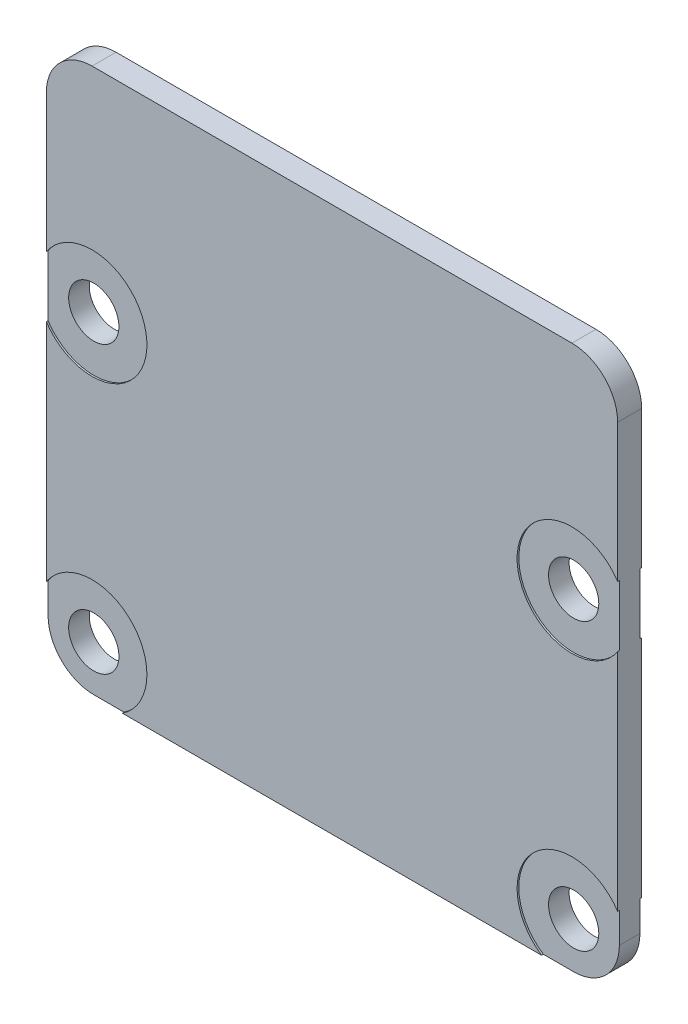
ISO-10303-21;
HEADER;
FILE_DESCRIPTION(('STEP AP214'),'2;1');
FILE_NAME('part.step','',(''),(''),'','','');
FILE_SCHEMA(('AUTOMOTIVE_DESIGN { 1 0 10303 214 1 1 1 1 }'));
ENDSEC;
DATA;
#1=APPLICATION_CONTEXT('core data for automotive mechanical design processes');
#2=APPLICATION_PROTOCOL_DEFINITION('international standard','automotive_design',2000,#1);
#3=PRODUCT_CONTEXT('',#1,'mechanical');
#4=PRODUCT('Part','Part','',(#3));
#5=PRODUCT_RELATED_PRODUCT_CATEGORY('part','',(#4));
#6=PRODUCT_DEFINITION_FORMATION('','',#4);
#7=PRODUCT_DEFINITION_CONTEXT('part definition',#1,'design');
#8=PRODUCT_DEFINITION('design','',#6,#7);
#9=PRODUCT_DEFINITION_SHAPE('','',#8);
#10=(LENGTH_UNIT() NAMED_UNIT(*) SI_UNIT(.MILLI.,.METRE.));
#11=(NAMED_UNIT(*) PLANE_ANGLE_UNIT() SI_UNIT($,.RADIAN.));
#12=(NAMED_UNIT(*) SI_UNIT($,.STERADIAN.) SOLID_ANGLE_UNIT());
#13=UNCERTAINTY_MEASURE_WITH_UNIT(LENGTH_MEASURE(1.E-05),#10,'distance_accuracy_value','');
#14=(GEOMETRIC_REPRESENTATION_CONTEXT(3) GLOBAL_UNCERTAINTY_ASSIGNED_CONTEXT((#13)) GLOBAL_UNIT_ASSIGNED_CONTEXT((#10,
#11,#12)) REPRESENTATION_CONTEXT('',''));
#15=CARTESIAN_POINT('',(0.,0.,0.));
#16=DIRECTION('',(0.,0.,1.));
#17=DIRECTION('',(1.,0.,0.));
#18=AXIS2_PLACEMENT_3D('',#15,#16,#17);
#19=CARTESIAN_POINT('',(0.,0.,-0.9));
#20=DIRECTION('',(0.,0.,1.));
#21=DIRECTION('',(1.,0.,0.));
#22=AXIS2_PLACEMENT_3D('',#19,#20,#21);
#23=PLANE('',#22);
#24=CARTESIAN_POINT('',(-10.5,0.100000000000003,-0.9));
#25=DIRECTION('',(0.,0.,1.));
#26=DIRECTION('',(1.,0.,0.));
#27=AXIS2_PLACEMENT_3D('',#24,#25,#26);
#28=CIRCLE('',#27,1.1);
#29=CARTESIAN_POINT('',(-9.4,0.100000000000003,-0.9));
#30=VERTEX_POINT('',#29);
#31=EDGE_CURVE('E348',#30,#30,#28,.T.);
#32=ORIENTED_EDGE('',*,*,#31,.T.);
#33=EDGE_LOOP('',(#32));
#34=FACE_BOUND('',#33,.T.);
#35=CARTESIAN_POINT('',(-10.5,0.100000000000003,-0.9));
#36=DIRECTION('',(0.,0.,1.));
#37=DIRECTION('',(-1.,0.,0.));
#38=AXIS2_PLACEMENT_3D('',#35,#36,#37);
#39=CIRCLE('',#38,2.4);
#40=CARTESIAN_POINT('',(-12.5,-1.22664991614215,-0.9));
#41=VERTEX_POINT('',#40);
#42=CARTESIAN_POINT('',(-12.5,1.42664991614216,-0.9));
#43=VERTEX_POINT('',#42);
#44=EDGE_CURVE('E216',#41,#43,#39,.T.);
#45=ORIENTED_EDGE('',*,*,#44,.F.);
#46=DIRECTION('',(0.,-1.,0.));
#47=VECTOR('',#46,1.);
#48=CARTESIAN_POINT('',(-12.5,9.462,-0.9));
#49=LINE('',#48,#47);
#50=EDGE_CURVE('E356',#43,#41,#49,.T.);
#51=ORIENTED_EDGE('',*,*,#50,.F.);
#52=EDGE_LOOP('',(#45,#51));
#53=FACE_BOUND('',#52,.T.);
#54=ADVANCED_FACE('F34',(#34,#53),#23,.F.);
#55=CARTESIAN_POINT('',(-10.5,-12.4,-0.9));
#56=DIRECTION('',(0.,0.,1.));
#57=DIRECTION('',(1.,0.,0.));
#58=AXIS2_PLACEMENT_3D('',#55,#56,#57);
#59=CIRCLE('',#58,1.1);
#60=CARTESIAN_POINT('',(-9.4,-12.4,-0.9));
#61=VERTEX_POINT('',#60);
#62=EDGE_CURVE('E330',#61,#61,#59,.T.);
#63=ORIENTED_EDGE('',*,*,#62,.T.);
#64=EDGE_LOOP('',(#63));
#65=FACE_BOUND('',#64,.T.);
#66=CARTESIAN_POINT('',(-10.5,-12.4,-0.9));
#67=DIRECTION('',(0.,0.,1.));
#68=DIRECTION('',(-1.,0.,0.));
#69=AXIS2_PLACEMENT_3D('',#66,#67,#68);
#70=CIRCLE('',#69,2.4);
#71=CARTESIAN_POINT('',(-9.17335008385784,-14.4,-0.9));
#72=VERTEX_POINT('',#71);
#73=CARTESIAN_POINT('',(-12.5,-11.0733500838578,-0.9));
#74=VERTEX_POINT('',#73);
#75=EDGE_CURVE('E219',#72,#74,#70,.T.);
#76=ORIENTED_EDGE('',*,*,#75,.F.);
#77=DIRECTION('',(1.,0.,0.));
#78=VECTOR('',#77,1.);
#79=CARTESIAN_POINT('',(-12.5,-14.4,-0.9));
#80=LINE('',#79,#78);
#81=CARTESIAN_POINT('',(-10.5,-14.4,-0.9));
#82=VERTEX_POINT('',#81);
#83=EDGE_CURVE('E358',#82,#72,#80,.T.);
#84=ORIENTED_EDGE('',*,*,#83,.F.);
#85=CARTESIAN_POINT('',(-10.5,-12.4,-0.9));
#86=DIRECTION('',(0.,0.,1.));
#87=DIRECTION('',(1.,0.,0.));
#88=AXIS2_PLACEMENT_3D('',#85,#86,#87);
#89=CIRCLE('',#88,2.);
#90=CARTESIAN_POINT('',(-12.5,-12.4,-0.9));
#91=VERTEX_POINT('',#90);
#92=EDGE_CURVE('E389',#82,#91,#89,.F.);
#93=ORIENTED_EDGE('',*,*,#92,.T.);
#94=EDGE_CURVE('E354',#74,#91,#49,.T.);
#95=ORIENTED_EDGE('',*,*,#94,.F.);
#96=EDGE_LOOP('',(#76,#84,#93,#95));
#97=FACE_BOUND('',#96,.T.);
#98=ADVANCED_FACE('F430',(#65,#97),#23,.F.);
#99=CARTESIAN_POINT('',(10.5,-12.4,-0.9));
#100=DIRECTION('',(0.,0.,1.));
#101=DIRECTION('',(1.,0.,0.));
#102=AXIS2_PLACEMENT_3D('',#99,#100,#101);
#103=CIRCLE('',#102,1.1);
#104=CARTESIAN_POINT('',(11.6,-12.4,-0.9));
#105=VERTEX_POINT('',#104);
#106=EDGE_CURVE('E337',#105,#105,#103,.T.);
#107=ORIENTED_EDGE('',*,*,#106,.T.);
#108=EDGE_LOOP('',(#107));
#109=FACE_BOUND('',#108,.T.);
#110=CARTESIAN_POINT('',(10.5,-12.4,-0.9));
#111=DIRECTION('',(0.,0.,1.));
#112=DIRECTION('',(-1.,0.,0.));
#113=AXIS2_PLACEMENT_3D('',#110,#111,#112);
#114=CIRCLE('',#113,2.4);
#115=CARTESIAN_POINT('',(12.5,-11.0733500838578,-0.9));
#116=VERTEX_POINT('',#115);
#117=CARTESIAN_POINT('',(9.17335008385784,-14.4,-0.9));
#118=VERTEX_POINT('',#117);
#119=EDGE_CURVE('E56',#116,#118,#114,.T.);
#120=ORIENTED_EDGE('',*,*,#119,.F.);
#121=DIRECTION('',(0.,1.,0.));
#122=VECTOR('',#121,1.);
#123=CARTESIAN_POINT('',(12.5,9.462,-0.9));
#124=LINE('',#123,#122);
#125=CARTESIAN_POINT('',(12.5,-12.4,-0.9));
#126=VERTEX_POINT('',#125);
#127=EDGE_CURVE('E363',#126,#116,#124,.T.);
#128=ORIENTED_EDGE('',*,*,#127,.F.);
#129=CARTESIAN_POINT('',(10.5,-12.4,-0.9));
#130=DIRECTION('',(0.,0.,1.));
#131=DIRECTION('',(1.,0.,0.));
#132=AXIS2_PLACEMENT_3D('',#129,#130,#131);
#133=CIRCLE('',#132,2.);
#134=CARTESIAN_POINT('',(10.5,-14.4,-0.9));
#135=VERTEX_POINT('',#134);
#136=EDGE_CURVE('E386',#126,#135,#133,.F.);
#137=ORIENTED_EDGE('',*,*,#136,.T.);
#138=EDGE_CURVE('E362',#118,#135,#80,.T.);
#139=ORIENTED_EDGE('',*,*,#138,.F.);
#140=EDGE_LOOP('',(#120,#128,#137,#139));
#141=FACE_BOUND('',#140,.T.);
#142=ADVANCED_FACE('F403',(#109,#141),#23,.F.);
#143=CARTESIAN_POINT('',(10.5,0.100000000000003,-0.9));
#144=DIRECTION('',(0.,0.,1.));
#145=DIRECTION('',(1.,0.,0.));
#146=AXIS2_PLACEMENT_3D('',#143,#144,#145);
#147=CIRCLE('',#146,1.1);
#148=CARTESIAN_POINT('',(11.6,0.100000000000003,-0.9));
#149=VERTEX_POINT('',#148);
#150=EDGE_CURVE('E343',#149,#149,#147,.T.);
#151=ORIENTED_EDGE('',*,*,#150,.T.);
#152=EDGE_LOOP('',(#151));
#153=FACE_BOUND('',#152,.T.);
#154=CARTESIAN_POINT('',(10.5,0.100000000000003,-0.9));
#155=DIRECTION('',(0.,0.,1.));
#156=DIRECTION('',(-1.,0.,0.));
#157=AXIS2_PLACEMENT_3D('',#154,#155,#156);
#158=CIRCLE('',#157,2.4);
#159=CARTESIAN_POINT('',(12.5,1.42664991614216,-0.9));
#160=VERTEX_POINT('',#159);
#161=CARTESIAN_POINT('',(12.5,-1.22664991614215,-0.9));
#162=VERTEX_POINT('',#161);
#163=EDGE_CURVE('E48',#160,#162,#158,.T.);
#164=ORIENTED_EDGE('',*,*,#163,.F.);
#165=EDGE_CURVE('E361',#162,#160,#124,.T.);
#166=ORIENTED_EDGE('',*,*,#165,.F.);
#167=EDGE_LOOP('',(#164,#166));
#168=FACE_BOUND('',#167,.T.);
#169=ADVANCED_FACE('F493',(#153,#168),#23,.F.);
#170=CARTESIAN_POINT('',(0.,0.,0.));
#171=DIRECTION('',(0.,0.,1.));
#172=DIRECTION('',(1.,0.,0.));
#173=AXIS2_PLACEMENT_3D('',#170,#171,#172);
#174=PLANE('',#173);
#175=CARTESIAN_POINT('',(10.5,0.100000000000003,0.));
#176=DIRECTION('',(0.,0.,1.));
#177=DIRECTION('',(1.,0.,0.));
#178=AXIS2_PLACEMENT_3D('',#175,#176,#177);
#179=CIRCLE('',#178,1.1);
#180=CARTESIAN_POINT('',(11.6,0.100000000000003,0.));
#181=VERTEX_POINT('',#180);
#182=EDGE_CURVE('E329',#181,#181,#179,.T.);
#183=ORIENTED_EDGE('',*,*,#182,.F.);
#184=EDGE_LOOP('',(#183));
#185=FACE_BOUND('',#184,.T.);
#186=CARTESIAN_POINT('',(10.5,0.100000000000003,0.));
#187=DIRECTION('',(0.,0.,-1.));
#188=DIRECTION('',(1.,0.,0.));
#189=AXIS2_PLACEMENT_3D('',#186,#187,#188);
#190=CIRCLE('',#189,2.4);
#191=CARTESIAN_POINT('',(12.5,-1.22664991614216,0.));
#192=VERTEX_POINT('',#191);
#193=CARTESIAN_POINT('',(12.5,1.42664991614216,0.));
#194=VERTEX_POINT('',#193);
#195=EDGE_CURVE('E271',#192,#194,#190,.T.);
#196=ORIENTED_EDGE('',*,*,#195,.F.);
#197=DIRECTION('',(0.,1.,0.));
#198=VECTOR('',#197,1.);
#199=CARTESIAN_POINT('',(12.5,9.462,0.));
#200=LINE('',#199,#198);
#201=EDGE_CURVE('E370',#192,#194,#200,.T.);
#202=ORIENTED_EDGE('',*,*,#201,.T.);
#203=EDGE_LOOP('',(#196,#202));
#204=FACE_BOUND('',#203,.T.);
#205=ADVANCED_FACE('F501',(#185,#204),#174,.T.);
#206=CARTESIAN_POINT('',(10.5,-12.4,0.));
#207=DIRECTION('',(0.,0.,1.));
#208=DIRECTION('',(1.,0.,0.));
#209=AXIS2_PLACEMENT_3D('',#206,#207,#208);
#210=CIRCLE('',#209,1.1);
#211=CARTESIAN_POINT('',(11.6,-12.4,0.));
#212=VERTEX_POINT('',#211);
#213=EDGE_CURVE('E340',#212,#212,#210,.T.);
#214=ORIENTED_EDGE('',*,*,#213,.F.);
#215=EDGE_LOOP('',(#214));
#216=FACE_BOUND('',#215,.T.);
#217=CARTESIAN_POINT('',(10.5,-12.4,0.));
#218=DIRECTION('',(0.,0.,-1.));
#219=DIRECTION('',(1.,0.,0.));
#220=AXIS2_PLACEMENT_3D('',#217,#218,#219);
#221=CIRCLE('',#220,2.4);
#222=CARTESIAN_POINT('',(9.17335008385784,-14.4,0.));
#223=VERTEX_POINT('',#222);
#224=CARTESIAN_POINT('',(12.5,-11.0733500838578,0.));
#225=VERTEX_POINT('',#224);
#226=EDGE_CURVE('E301',#223,#225,#221,.T.);
#227=ORIENTED_EDGE('',*,*,#226,.F.);
#228=DIRECTION('',(1.,0.,0.));
#229=VECTOR('',#228,1.);
#230=CARTESIAN_POINT('',(-12.5,-14.4,0.));
#231=LINE('',#230,#229);
#232=CARTESIAN_POINT('',(10.5,-14.4,0.));
#233=VERTEX_POINT('',#232);
#234=EDGE_CURVE('E371',#223,#233,#231,.T.);
#235=ORIENTED_EDGE('',*,*,#234,.T.);
#236=CARTESIAN_POINT('',(10.5,-12.4,0.));
#237=DIRECTION('',(0.,0.,1.));
#238=DIRECTION('',(1.,0.,0.));
#239=AXIS2_PLACEMENT_3D('',#236,#237,#238);
#240=CIRCLE('',#239,2.);
#241=CARTESIAN_POINT('',(12.5,-12.4,0.));
#242=VERTEX_POINT('',#241);
#243=EDGE_CURVE('E377',#233,#242,#240,.T.);
#244=ORIENTED_EDGE('',*,*,#243,.T.);
#245=EDGE_CURVE('E357',#242,#225,#200,.T.);
#246=ORIENTED_EDGE('',*,*,#245,.T.);
#247=EDGE_LOOP('',(#227,#235,#244,#246));
#248=FACE_BOUND('',#247,.T.);
#249=ADVANCED_FACE('F457',(#216,#248),#174,.T.);
#250=CARTESIAN_POINT('',(-10.5,-12.4,0.));
#251=DIRECTION('',(0.,0.,1.));
#252=DIRECTION('',(1.,0.,0.));
#253=AXIS2_PLACEMENT_3D('',#250,#251,#252);
#254=CIRCLE('',#253,1.1);
#255=CARTESIAN_POINT('',(-9.4,-12.4,0.));
#256=VERTEX_POINT('',#255);
#257=EDGE_CURVE('E334',#256,#256,#254,.T.);
#258=ORIENTED_EDGE('',*,*,#257,.F.);
#259=EDGE_LOOP('',(#258));
#260=FACE_BOUND('',#259,.T.);
#261=CARTESIAN_POINT('',(-10.5,-12.4,0.));
#262=DIRECTION('',(0.,0.,-1.));
#263=DIRECTION('',(1.,0.,0.));
#264=AXIS2_PLACEMENT_3D('',#261,#262,#263);
#265=CIRCLE('',#264,2.4);
#266=CARTESIAN_POINT('',(-12.5,-11.0733500838578,0.));
#267=VERTEX_POINT('',#266);
#268=CARTESIAN_POINT('',(-9.17335008385784,-14.4,0.));
#269=VERTEX_POINT('',#268);
#270=EDGE_CURVE('E298',#267,#269,#265,.T.);
#271=ORIENTED_EDGE('',*,*,#270,.F.);
#272=DIRECTION('',(0.,-1.,0.));
#273=VECTOR('',#272,1.);
#274=CARTESIAN_POINT('',(-12.5,9.462,0.));
#275=LINE('',#274,#273);
#276=CARTESIAN_POINT('',(-12.5,-12.4,0.));
#277=VERTEX_POINT('',#276);
#278=EDGE_CURVE('E351',#267,#277,#275,.T.);
#279=ORIENTED_EDGE('',*,*,#278,.T.);
#280=CARTESIAN_POINT('',(-10.5,-12.4,0.));
#281=DIRECTION('',(0.,0.,1.));
#282=DIRECTION('',(1.,0.,0.));
#283=AXIS2_PLACEMENT_3D('',#280,#281,#282);
#284=CIRCLE('',#283,2.);
#285=CARTESIAN_POINT('',(-10.5,-14.4,0.));
#286=VERTEX_POINT('',#285);
#287=EDGE_CURVE('E379',#277,#286,#284,.T.);
#288=ORIENTED_EDGE('',*,*,#287,.T.);
#289=EDGE_CURVE('E368',#286,#269,#231,.T.);
#290=ORIENTED_EDGE('',*,*,#289,.T.);
#291=EDGE_LOOP('',(#271,#279,#288,#290));
#292=FACE_BOUND('',#291,.T.);
#293=ADVANCED_FACE('F540',(#260,#292),#174,.T.);
#294=CARTESIAN_POINT('',(-10.5,0.100000000000003,0.));
#295=DIRECTION('',(0.,0.,1.));
#296=DIRECTION('',(1.,0.,0.));
#297=AXIS2_PLACEMENT_3D('',#294,#295,#296);
#298=CIRCLE('',#297,1.1);
#299=CARTESIAN_POINT('',(-9.4,0.100000000000003,0.));
#300=VERTEX_POINT('',#299);
#301=EDGE_CURVE('E333',#300,#300,#298,.T.);
#302=ORIENTED_EDGE('',*,*,#301,.F.);
#303=EDGE_LOOP('',(#302));
#304=FACE_BOUND('',#303,.T.);
#305=CARTESIAN_POINT('',(-10.5,0.100000000000003,0.));
#306=DIRECTION('',(0.,0.,-1.));
#307=DIRECTION('',(1.,0.,0.));
#308=AXIS2_PLACEMENT_3D('',#305,#306,#307);
#309=CIRCLE('',#308,2.4);
#310=CARTESIAN_POINT('',(-12.5,1.42664991614216,0.));
#311=VERTEX_POINT('',#310);
#312=CARTESIAN_POINT('',(-12.5,-1.22664991614215,0.));
#313=VERTEX_POINT('',#312);
#314=EDGE_CURVE('E268',#311,#313,#309,.T.);
#315=ORIENTED_EDGE('',*,*,#314,.F.);
#316=EDGE_CURVE('E367',#311,#313,#275,.T.);
#317=ORIENTED_EDGE('',*,*,#316,.T.);
#318=EDGE_LOOP('',(#315,#317));
#319=FACE_BOUND('',#318,.T.);
#320=ADVANCED_FACE('F455',(#304,#319),#174,.T.);
#321=CARTESIAN_POINT('',(-12.5,9.462,-0.9));
#322=DIRECTION('',(-1.,0.,0.));
#323=DIRECTION('',(0.,-1.,0.));
#324=AXIS2_PLACEMENT_3D('',#321,#322,#323);
#325=PLANE('',#324);
#326=DIRECTION('',(0.,0.,1.));
#327=VECTOR('',#326,1.);
#328=CARTESIAN_POINT('',(-12.5,7.462,-0.9));
#329=LINE('',#328,#327);
#330=CARTESIAN_POINT('',(-12.5,7.462,0.075));
#331=VERTEX_POINT('',#330);
#332=CARTESIAN_POINT('',(-12.5,7.462,-0.975));
#333=VERTEX_POINT('',#332);
#334=EDGE_CURVE('E365',#331,#333,#329,.F.);
#335=ORIENTED_EDGE('',*,*,#334,.T.);
#336=DIRECTION('',(0.,1.,0.));
#337=VECTOR('',#336,1.);
#338=CARTESIAN_POINT('',(-12.5,1.42664991614216,-0.975));
#339=LINE('',#338,#337);
#340=CARTESIAN_POINT('',(-12.5,1.42664991614216,-0.975));
#341=VERTEX_POINT('',#340);
#342=EDGE_CURVE('E215',#341,#333,#339,.T.);
#343=ORIENTED_EDGE('',*,*,#342,.F.);
#344=DIRECTION('',(0.,0.,1.));
#345=VECTOR('',#344,1.);
#346=CARTESIAN_POINT('',(-12.5,1.42664991614216,-0.975));
#347=LINE('',#346,#345);
#348=EDGE_CURVE('E240',#341,#43,#347,.T.);
#349=ORIENTED_EDGE('',*,*,#348,.T.);
#350=ORIENTED_EDGE('',*,*,#50,.T.);
#351=DIRECTION('',(0.,0.,1.));
#352=VECTOR('',#351,1.);
#353=CARTESIAN_POINT('',(-12.5,-1.22664991614215,-0.975));
#354=LINE('',#353,#352);
#355=CARTESIAN_POINT('',(-12.5,-1.22664991614215,-0.975));
#356=VERTEX_POINT('',#355);
#357=EDGE_CURVE('E247',#356,#41,#354,.T.);
#358=ORIENTED_EDGE('',*,*,#357,.F.);
#359=DIRECTION('',(0.,1.,0.));
#360=VECTOR('',#359,1.);
#361=CARTESIAN_POINT('',(-12.5,-11.0733500838578,-0.975));
#362=LINE('',#361,#360);
#363=CARTESIAN_POINT('',(-12.5,-11.0733500838578,-0.975));
#364=VERTEX_POINT('',#363);
#365=EDGE_CURVE('E235',#364,#356,#362,.T.);
#366=ORIENTED_EDGE('',*,*,#365,.F.);
#367=DIRECTION('',(0.,0.,1.));
#368=VECTOR('',#367,1.);
#369=CARTESIAN_POINT('',(-12.5,-11.0733500838578,-0.975));
#370=LINE('',#369,#368);
#371=EDGE_CURVE('E250',#364,#74,#370,.T.);
#372=ORIENTED_EDGE('',*,*,#371,.T.);
#373=ORIENTED_EDGE('',*,*,#94,.T.);
#374=DIRECTION('',(0.,0.,1.));
#375=VECTOR('',#374,1.);
#376=CARTESIAN_POINT('',(-12.5,-12.4,-0.9));
#377=LINE('',#376,#375);
#378=EDGE_CURVE('E374',#91,#277,#377,.T.);
#379=ORIENTED_EDGE('',*,*,#378,.T.);
#380=ORIENTED_EDGE('',*,*,#278,.F.);
#381=DIRECTION('',(0.,0.,-1.));
#382=VECTOR('',#381,1.);
#383=CARTESIAN_POINT('',(-12.5,-11.0733500838578,0.075));
#384=LINE('',#383,#382);
#385=CARTESIAN_POINT('',(-12.5,-11.0733500838578,0.075));
#386=VERTEX_POINT('',#385);
#387=EDGE_CURVE('E320',#386,#267,#384,.T.);
#388=ORIENTED_EDGE('',*,*,#387,.F.);
#389=DIRECTION('',(0.,-1.,0.));
#390=VECTOR('',#389,1.);
#391=CARTESIAN_POINT('',(-12.5,-1.22664991614215,0.075));
#392=LINE('',#391,#390);
#393=CARTESIAN_POINT('',(-12.5,-1.22664991614215,0.075));
#394=VERTEX_POINT('',#393);
#395=EDGE_CURVE('E275',#394,#386,#392,.T.);
#396=ORIENTED_EDGE('',*,*,#395,.F.);
#397=DIRECTION('',(0.,0.,-1.));
#398=VECTOR('',#397,1.);
#399=CARTESIAN_POINT('',(-12.5,-1.22664991614215,0.075));
#400=LINE('',#399,#398);
#401=EDGE_CURVE('E323',#394,#313,#400,.T.);
#402=ORIENTED_EDGE('',*,*,#401,.T.);
#403=ORIENTED_EDGE('',*,*,#316,.F.);
#404=DIRECTION('',(0.,0.,-1.));
#405=VECTOR('',#404,1.);
#406=CARTESIAN_POINT('',(-12.5,1.42664991614216,0.075));
#407=LINE('',#406,#405);
#408=CARTESIAN_POINT('',(-12.5,1.42664991614216,0.075));
#409=VERTEX_POINT('',#408);
#410=EDGE_CURVE('E326',#409,#311,#407,.T.);
#411=ORIENTED_EDGE('',*,*,#410,.F.);
#412=DIRECTION('',(0.,-1.,0.));
#413=VECTOR('',#412,1.);
#414=CARTESIAN_POINT('',(-12.5,7.462,0.075));
#415=LINE('',#414,#413);
#416=EDGE_CURVE('E270',#331,#409,#415,.T.);
#417=ORIENTED_EDGE('',*,*,#416,.F.);
#418=EDGE_LOOP('',(#335,#343,#349,#350,#358,#366,#372,#373,#379,#380,#388,#396,#402,#403,#411,#417));
#419=FACE_BOUND('',#418,.T.);
#420=ADVANCED_FACE('F416',(#419),#325,.T.);
#421=CARTESIAN_POINT('',(-12.5,9.462,-0.9));
#422=DIRECTION('',(0.,1.,0.));
#423=DIRECTION('',(0.,0.,1.));
#424=AXIS2_PLACEMENT_3D('',#421,#422,#423);
#425=PLANE('',#424);
#426=DIRECTION('',(0.,0.,1.));
#427=VECTOR('',#426,1.);
#428=CARTESIAN_POINT('',(10.5,9.462,-0.9));
#429=LINE('',#428,#427);
#430=CARTESIAN_POINT('',(10.5,9.462,0.075));
#431=VERTEX_POINT('',#430);
#432=CARTESIAN_POINT('',(10.5,9.462,-0.975));
#433=VERTEX_POINT('',#432);
#434=EDGE_CURVE('E42',#431,#433,#429,.F.);
#435=ORIENTED_EDGE('',*,*,#434,.T.);
#436=DIRECTION('',(1.,0.,0.));
#437=VECTOR('',#436,1.);
#438=CARTESIAN_POINT('',(-10.5,9.462,-0.975));
#439=LINE('',#438,#437);
#440=CARTESIAN_POINT('',(-10.5,9.462,-0.975));
#441=VERTEX_POINT('',#440);
#442=EDGE_CURVE('E205',#441,#433,#439,.T.);
#443=ORIENTED_EDGE('',*,*,#442,.F.);
#444=DIRECTION('',(0.,0.,1.));
#445=VECTOR('',#444,1.);
#446=CARTESIAN_POINT('',(-10.5,9.462,-0.9));
#447=LINE('',#446,#445);
#448=CARTESIAN_POINT('',(-10.5,9.462,0.075));
#449=VERTEX_POINT('',#448);
#450=EDGE_CURVE('E11',#441,#449,#447,.T.);
#451=ORIENTED_EDGE('',*,*,#450,.T.);
#452=DIRECTION('',(-1.,0.,0.));
#453=VECTOR('',#452,1.);
#454=CARTESIAN_POINT('',(10.5,9.462,0.075));
#455=LINE('',#454,#453);
#456=EDGE_CURVE('E293',#431,#449,#455,.T.);
#457=ORIENTED_EDGE('',*,*,#456,.F.);
#458=EDGE_LOOP('',(#435,#443,#451,#457));
#459=FACE_BOUND('',#458,.T.);
#460=ADVANCED_FACE('F206',(#459),#425,.T.);
#461=CARTESIAN_POINT('',(12.5,9.462,-0.9));
#462=DIRECTION('',(1.,0.,0.));
#463=DIRECTION('',(0.,1.,0.));
#464=AXIS2_PLACEMENT_3D('',#461,#462,#463);
#465=PLANE('',#464);
#466=ORIENTED_EDGE('',*,*,#245,.F.);
#467=DIRECTION('',(0.,0.,1.));
#468=VECTOR('',#467,1.);
#469=CARTESIAN_POINT('',(12.5,-12.4,-0.9));
#470=LINE('',#469,#468);
#471=EDGE_CURVE('E394',#242,#126,#470,.F.);
#472=ORIENTED_EDGE('',*,*,#471,.T.);
#473=ORIENTED_EDGE('',*,*,#127,.T.);
#474=DIRECTION('',(0.,0.,1.));
#475=VECTOR('',#474,1.);
#476=CARTESIAN_POINT('',(12.5,-11.0733500838578,-0.975));
#477=LINE('',#476,#475);
#478=CARTESIAN_POINT('',(12.5,-11.0733500838578,-0.975));
#479=VERTEX_POINT('',#478);
#480=EDGE_CURVE('E259',#479,#116,#477,.T.);
#481=ORIENTED_EDGE('',*,*,#480,.F.);
#482=DIRECTION('',(0.,-1.,0.));
#483=VECTOR('',#482,1.);
#484=CARTESIAN_POINT('',(12.5,-1.22664991614215,-0.975));
#485=LINE('',#484,#483);
#486=CARTESIAN_POINT('',(12.5,-1.22664991614215,-0.975));
#487=VERTEX_POINT('',#486);
#488=EDGE_CURVE('E227',#487,#479,#485,.T.);
#489=ORIENTED_EDGE('',*,*,#488,.F.);
#490=DIRECTION('',(0.,0.,1.));
#491=VECTOR('',#490,1.);
#492=CARTESIAN_POINT('',(12.5,-1.22664991614215,-0.975));
#493=LINE('',#492,#491);
#494=EDGE_CURVE('E262',#487,#162,#493,.T.);
#495=ORIENTED_EDGE('',*,*,#494,.T.);
#496=ORIENTED_EDGE('',*,*,#165,.T.);
#497=DIRECTION('',(0.,0.,1.));
#498=VECTOR('',#497,1.);
#499=CARTESIAN_POINT('',(12.5,1.42664991614216,-0.975));
#500=LINE('',#499,#498);
#501=CARTESIAN_POINT('',(12.5,1.42664991614216,-0.975));
#502=VERTEX_POINT('',#501);
#503=EDGE_CURVE('E265',#502,#160,#500,.T.);
#504=ORIENTED_EDGE('',*,*,#503,.F.);
#505=DIRECTION('',(0.,-1.,0.));
#506=VECTOR('',#505,1.);
#507=CARTESIAN_POINT('',(12.5,7.462,-0.975));
#508=LINE('',#507,#506);
#509=CARTESIAN_POINT('',(12.5,7.462,-0.975));
#510=VERTEX_POINT('',#509);
#511=EDGE_CURVE('E223',#510,#502,#508,.T.);
#512=ORIENTED_EDGE('',*,*,#511,.F.);
#513=DIRECTION('',(0.,0.,1.));
#514=VECTOR('',#513,1.);
#515=CARTESIAN_POINT('',(12.5,7.462,-0.9));
#516=LINE('',#515,#514);
#517=CARTESIAN_POINT('',(12.5,7.462,0.075));
#518=VERTEX_POINT('',#517);
#519=EDGE_CURVE('E392',#510,#518,#516,.T.);
#520=ORIENTED_EDGE('',*,*,#519,.T.);
#521=DIRECTION('',(0.,1.,0.));
#522=VECTOR('',#521,1.);
#523=CARTESIAN_POINT('',(12.5,1.42664991614216,0.075));
#524=LINE('',#523,#522);
#525=CARTESIAN_POINT('',(12.5,1.42664991614216,0.075));
#526=VERTEX_POINT('',#525);
#527=EDGE_CURVE('E287',#526,#518,#524,.T.);
#528=ORIENTED_EDGE('',*,*,#527,.F.);
#529=DIRECTION('',(0.,0.,-1.));
#530=VECTOR('',#529,1.);
#531=CARTESIAN_POINT('',(12.5,1.42664991614216,0.075));
#532=LINE('',#531,#530);
#533=EDGE_CURVE('E295',#526,#194,#532,.T.);
#534=ORIENTED_EDGE('',*,*,#533,.T.);
#535=ORIENTED_EDGE('',*,*,#201,.F.);
#536=DIRECTION('',(0.,0.,-1.));
#537=VECTOR('',#536,1.);
#538=CARTESIAN_POINT('',(12.5,-1.22664991614216,0.075));
#539=LINE('',#538,#537);
#540=CARTESIAN_POINT('',(12.5,-1.22664991614216,0.075));
#541=VERTEX_POINT('',#540);
#542=EDGE_CURVE('E308',#541,#192,#539,.T.);
#543=ORIENTED_EDGE('',*,*,#542,.F.);
#544=DIRECTION('',(0.,1.,0.));
#545=VECTOR('',#544,1.);
#546=CARTESIAN_POINT('',(12.5,-11.0733500838578,0.075));
#547=LINE('',#546,#545);
#548=CARTESIAN_POINT('',(12.5,-11.0733500838578,0.075));
#549=VERTEX_POINT('',#548);
#550=EDGE_CURVE('E283',#549,#541,#547,.T.);
#551=ORIENTED_EDGE('',*,*,#550,.F.);
#552=DIRECTION('',(0.,0.,-1.));
#553=VECTOR('',#552,1.);
#554=CARTESIAN_POINT('',(12.5,-11.0733500838578,0.075));
#555=LINE('',#554,#553);
#556=EDGE_CURVE('E311',#549,#225,#555,.T.);
#557=ORIENTED_EDGE('',*,*,#556,.T.);
#558=EDGE_LOOP('',(#466,#472,#473,#481,#489,#495,#496,#504,#512,#520,#528,#534,#535,#543,#551,#557));
#559=FACE_BOUND('',#558,.T.);
#560=ADVANCED_FACE('F398',(#559),#465,.T.);
#561=CARTESIAN_POINT('',(-12.5,-14.4,-0.9));
#562=DIRECTION('',(0.,-1.,0.));
#563=DIRECTION('',(0.,0.,-1.));
#564=AXIS2_PLACEMENT_3D('',#561,#562,#563);
#565=PLANE('',#564);
#566=ORIENTED_EDGE('',*,*,#289,.F.);
#567=DIRECTION('',(0.,0.,1.));
#568=VECTOR('',#567,1.);
#569=CARTESIAN_POINT('',(-10.5,-14.4,-0.9));
#570=LINE('',#569,#568);
#571=EDGE_CURVE('E384',#286,#82,#570,.F.);
#572=ORIENTED_EDGE('',*,*,#571,.T.);
#573=ORIENTED_EDGE('',*,*,#83,.T.);
#574=DIRECTION('',(0.,0.,1.));
#575=VECTOR('',#574,1.);
#576=CARTESIAN_POINT('',(-9.17335008385784,-14.4,-0.975));
#577=LINE('',#576,#575);
#578=CARTESIAN_POINT('',(-9.17335008385784,-14.4,-0.975));
#579=VERTEX_POINT('',#578);
#580=EDGE_CURVE('E253',#579,#72,#577,.T.);
#581=ORIENTED_EDGE('',*,*,#580,.F.);
#582=DIRECTION('',(-1.,0.,0.));
#583=VECTOR('',#582,1.);
#584=CARTESIAN_POINT('',(9.17335008385785,-14.4,-0.975));
#585=LINE('',#584,#583);
#586=CARTESIAN_POINT('',(9.17335008385785,-14.4,-0.975));
#587=VERTEX_POINT('',#586);
#588=EDGE_CURVE('E231',#587,#579,#585,.T.);
#589=ORIENTED_EDGE('',*,*,#588,.F.);
#590=DIRECTION('',(0.,0.,1.));
#591=VECTOR('',#590,1.);
#592=CARTESIAN_POINT('',(9.17335008385785,-14.4,-0.975));
#593=LINE('',#592,#591);
#594=EDGE_CURVE('E256',#587,#118,#593,.T.);
#595=ORIENTED_EDGE('',*,*,#594,.T.);
#596=ORIENTED_EDGE('',*,*,#138,.T.);
#597=DIRECTION('',(0.,0.,1.));
#598=VECTOR('',#597,1.);
#599=CARTESIAN_POINT('',(10.5,-14.4,-0.9));
#600=LINE('',#599,#598);
#601=EDGE_CURVE('E381',#135,#233,#600,.T.);
#602=ORIENTED_EDGE('',*,*,#601,.T.);
#603=ORIENTED_EDGE('',*,*,#234,.F.);
#604=DIRECTION('',(0.,0.,-1.));
#605=VECTOR('',#604,1.);
#606=CARTESIAN_POINT('',(9.17335008385785,-14.4,0.075));
#607=LINE('',#606,#605);
#608=CARTESIAN_POINT('',(9.17335008385785,-14.4,0.075));
#609=VERTEX_POINT('',#608);
#610=EDGE_CURVE('E314',#609,#223,#607,.T.);
#611=ORIENTED_EDGE('',*,*,#610,.F.);
#612=DIRECTION('',(1.,0.,0.));
#613=VECTOR('',#612,1.);
#614=CARTESIAN_POINT('',(-9.17335008385784,-14.4,0.075));
#615=LINE('',#614,#613);
#616=CARTESIAN_POINT('',(-9.17335008385784,-14.4,0.075));
#617=VERTEX_POINT('',#616);
#618=EDGE_CURVE('E279',#617,#609,#615,.T.);
#619=ORIENTED_EDGE('',*,*,#618,.F.);
#620=DIRECTION('',(0.,0.,-1.));
#621=VECTOR('',#620,1.);
#622=CARTESIAN_POINT('',(-9.17335008385784,-14.4,0.075));
#623=LINE('',#622,#621);
#624=EDGE_CURVE('E317',#617,#269,#623,.T.);
#625=ORIENTED_EDGE('',*,*,#624,.T.);
#626=EDGE_LOOP('',(#566,#572,#573,#581,#589,#595,#596,#602,#603,#611,#619,#625));
#627=FACE_BOUND('',#626,.T.);
#628=ADVANCED_FACE('F409',(#627),#565,.T.);
#629=CARTESIAN_POINT('',(-10.5,-12.4,-0.9));
#630=DIRECTION('',(0.,0.,1.));
#631=DIRECTION('',(1.,0.,0.));
#632=AXIS2_PLACEMENT_3D('',#629,#630,#631);
#633=CYLINDRICAL_SURFACE('',#632,2.);
#634=ORIENTED_EDGE('',*,*,#92,.F.);
#635=ORIENTED_EDGE('',*,*,#571,.F.);
#636=ORIENTED_EDGE('',*,*,#287,.F.);
#637=ORIENTED_EDGE('',*,*,#378,.F.);
#638=EDGE_LOOP('',(#634,#635,#636,#637));
#639=FACE_BOUND('',#638,.T.);
#640=ADVANCED_FACE('F435',(#639),#633,.T.);
#641=CARTESIAN_POINT('',(10.5,-12.4,-0.9));
#642=DIRECTION('',(0.,0.,1.));
#643=DIRECTION('',(1.,0.,0.));
#644=AXIS2_PLACEMENT_3D('',#641,#642,#643);
#645=CYLINDRICAL_SURFACE('',#644,2.);
#646=ORIENTED_EDGE('',*,*,#136,.F.);
#647=ORIENTED_EDGE('',*,*,#471,.F.);
#648=ORIENTED_EDGE('',*,*,#243,.F.);
#649=ORIENTED_EDGE('',*,*,#601,.F.);
#650=EDGE_LOOP('',(#646,#647,#648,#649));
#651=FACE_BOUND('',#650,.T.);
#652=ADVANCED_FACE('F405',(#651),#645,.T.);
#653=CARTESIAN_POINT('',(-10.5,7.462,-0.9));
#654=DIRECTION('',(0.,0.,1.));
#655=DIRECTION('',(1.,0.,0.));
#656=AXIS2_PLACEMENT_3D('',#653,#654,#655);
#657=CYLINDRICAL_SURFACE('',#656,2.);
#658=ORIENTED_EDGE('',*,*,#450,.F.);
#659=CARTESIAN_POINT('',(-10.5,7.462,-0.975));
#660=DIRECTION('',(0.,0.,-1.));
#661=DIRECTION('',(-1.,0.,0.));
#662=AXIS2_PLACEMENT_3D('',#659,#660,#661);
#663=CIRCLE('',#662,2.);
#664=EDGE_CURVE('E198',#333,#441,#663,.T.);
#665=ORIENTED_EDGE('',*,*,#664,.F.);
#666=ORIENTED_EDGE('',*,*,#334,.F.);
#667=CARTESIAN_POINT('',(-10.5,7.462,0.075));
#668=DIRECTION('',(0.,0.,1.));
#669=DIRECTION('',(1.,0.,0.));
#670=AXIS2_PLACEMENT_3D('',#667,#668,#669);
#671=CIRCLE('',#670,2.);
#672=EDGE_CURVE('E200',#449,#331,#671,.T.);
#673=ORIENTED_EDGE('',*,*,#672,.F.);
#674=EDGE_LOOP('',(#658,#665,#666,#673));
#675=FACE_BOUND('',#674,.T.);
#676=ADVANCED_FACE('F196',(#675),#657,.T.);
#677=CARTESIAN_POINT('',(10.5,7.462,-0.9));
#678=DIRECTION('',(0.,0.,1.));
#679=DIRECTION('',(1.,0.,0.));
#680=AXIS2_PLACEMENT_3D('',#677,#678,#679);
#681=CYLINDRICAL_SURFACE('',#680,2.);
#682=ORIENTED_EDGE('',*,*,#519,.F.);
#683=CARTESIAN_POINT('',(10.5,7.462,-0.975));
#684=DIRECTION('',(0.,0.,-1.));
#685=DIRECTION('',(-1.,0.,0.));
#686=AXIS2_PLACEMENT_3D('',#683,#684,#685);
#687=CIRCLE('',#686,2.);
#688=EDGE_CURVE('E210',#433,#510,#687,.T.);
#689=ORIENTED_EDGE('',*,*,#688,.F.);
#690=ORIENTED_EDGE('',*,*,#434,.F.);
#691=CARTESIAN_POINT('',(10.5,7.462,0.075));
#692=DIRECTION('',(0.,0.,1.));
#693=DIRECTION('',(1.,0.,0.));
#694=AXIS2_PLACEMENT_3D('',#691,#692,#693);
#695=CIRCLE('',#694,2.);
#696=EDGE_CURVE('E290',#518,#431,#695,.T.);
#697=ORIENTED_EDGE('',*,*,#696,.F.);
#698=EDGE_LOOP('',(#682,#689,#690,#697));
#699=FACE_BOUND('',#698,.T.);
#700=ADVANCED_FACE('F36',(#699),#681,.T.);
#701=CARTESIAN_POINT('',(-10.5,0.100000000000003,-0.9));
#702=DIRECTION('',(0.,0.,1.));
#703=DIRECTION('',(1.,0.,0.));
#704=AXIS2_PLACEMENT_3D('',#701,#702,#703);
#705=CYLINDRICAL_SURFACE('',#704,1.1);
#706=ORIENTED_EDGE('',*,*,#31,.F.);
#707=EDGE_LOOP('',(#706));
#708=FACE_BOUND('',#707,.T.);
#709=ORIENTED_EDGE('',*,*,#301,.T.);
#710=EDGE_LOOP('',(#709));
#711=FACE_BOUND('',#710,.T.);
#712=ADVANCED_FACE('F527',(#708,#711),#705,.F.);
#713=CARTESIAN_POINT('',(-10.5,-12.4,-0.9));
#714=DIRECTION('',(0.,0.,1.));
#715=DIRECTION('',(1.,0.,0.));
#716=AXIS2_PLACEMENT_3D('',#713,#714,#715);
#717=CYLINDRICAL_SURFACE('',#716,1.1);
#718=ORIENTED_EDGE('',*,*,#62,.F.);
#719=EDGE_LOOP('',(#718));
#720=FACE_BOUND('',#719,.T.);
#721=ORIENTED_EDGE('',*,*,#257,.T.);
#722=EDGE_LOOP('',(#721));
#723=FACE_BOUND('',#722,.T.);
#724=ADVANCED_FACE('F523',(#720,#723),#717,.F.);
#725=CARTESIAN_POINT('',(10.5,-12.4,-0.9));
#726=DIRECTION('',(0.,0.,1.));
#727=DIRECTION('',(1.,0.,0.));
#728=AXIS2_PLACEMENT_3D('',#725,#726,#727);
#729=CYLINDRICAL_SURFACE('',#728,1.1);
#730=ORIENTED_EDGE('',*,*,#106,.F.);
#731=EDGE_LOOP('',(#730));
#732=FACE_BOUND('',#731,.T.);
#733=ORIENTED_EDGE('',*,*,#213,.T.);
#734=EDGE_LOOP('',(#733));
#735=FACE_BOUND('',#734,.T.);
#736=ADVANCED_FACE('F514',(#732,#735),#729,.F.);
#737=CARTESIAN_POINT('',(10.5,0.100000000000003,-0.9));
#738=DIRECTION('',(0.,0.,1.));
#739=DIRECTION('',(1.,0.,0.));
#740=AXIS2_PLACEMENT_3D('',#737,#738,#739);
#741=CYLINDRICAL_SURFACE('',#740,1.1);
#742=ORIENTED_EDGE('',*,*,#150,.F.);
#743=EDGE_LOOP('',(#742));
#744=FACE_BOUND('',#743,.T.);
#745=ORIENTED_EDGE('',*,*,#182,.T.);
#746=EDGE_LOOP('',(#745));
#747=FACE_BOUND('',#746,.T.);
#748=ADVANCED_FACE('F511',(#744,#747),#741,.F.);
#749=CARTESIAN_POINT('',(-10.5,0.100000000000003,0.075));
#750=DIRECTION('',(0.,0.,-1.));
#751=DIRECTION('',(-1.,0.,0.));
#752=AXIS2_PLACEMENT_3D('',#749,#750,#751);
#753=CYLINDRICAL_SURFACE('',#752,2.4);
#754=ORIENTED_EDGE('',*,*,#314,.T.);
#755=ORIENTED_EDGE('',*,*,#401,.F.);
#756=CARTESIAN_POINT('',(-10.5,0.100000000000003,0.075));
#757=DIRECTION('',(0.,0.,-1.));
#758=DIRECTION('',(1.,0.,0.));
#759=AXIS2_PLACEMENT_3D('',#756,#757,#758);
#760=CIRCLE('',#759,2.4);
#761=EDGE_CURVE('E273',#409,#394,#760,.T.);
#762=ORIENTED_EDGE('',*,*,#761,.F.);
#763=ORIENTED_EDGE('',*,*,#410,.T.);
#764=EDGE_LOOP('',(#754,#755,#762,#763));
#765=FACE_BOUND('',#764,.T.);
#766=ADVANCED_FACE('F453',(#765),#753,.F.);
#767=CARTESIAN_POINT('',(-10.5,-12.4,0.075));
#768=DIRECTION('',(0.,0.,-1.));
#769=DIRECTION('',(-1.,0.,0.));
#770=AXIS2_PLACEMENT_3D('',#767,#768,#769);
#771=CYLINDRICAL_SURFACE('',#770,2.4);
#772=ORIENTED_EDGE('',*,*,#270,.T.);
#773=ORIENTED_EDGE('',*,*,#624,.F.);
#774=CARTESIAN_POINT('',(-10.5,-12.4,0.075));
#775=DIRECTION('',(0.,0.,-1.));
#776=DIRECTION('',(1.,0.,0.));
#777=AXIS2_PLACEMENT_3D('',#774,#775,#776);
#778=CIRCLE('',#777,2.4);
#779=EDGE_CURVE('E277',#386,#617,#778,.T.);
#780=ORIENTED_EDGE('',*,*,#779,.F.);
#781=ORIENTED_EDGE('',*,*,#387,.T.);
#782=EDGE_LOOP('',(#772,#773,#780,#781));
#783=FACE_BOUND('',#782,.T.);
#784=ADVANCED_FACE('F443',(#783),#771,.F.);
#785=CARTESIAN_POINT('',(10.5,-12.4,0.075));
#786=DIRECTION('',(0.,0.,-1.));
#787=DIRECTION('',(-1.,0.,0.));
#788=AXIS2_PLACEMENT_3D('',#785,#786,#787);
#789=CYLINDRICAL_SURFACE('',#788,2.4);
#790=ORIENTED_EDGE('',*,*,#226,.T.);
#791=ORIENTED_EDGE('',*,*,#556,.F.);
#792=CARTESIAN_POINT('',(10.5,-12.4,0.075));
#793=DIRECTION('',(0.,0.,-1.));
#794=DIRECTION('',(1.,0.,0.));
#795=AXIS2_PLACEMENT_3D('',#792,#793,#794);
#796=CIRCLE('',#795,2.4);
#797=EDGE_CURVE('E281',#609,#549,#796,.T.);
#798=ORIENTED_EDGE('',*,*,#797,.F.);
#799=ORIENTED_EDGE('',*,*,#610,.T.);
#800=EDGE_LOOP('',(#790,#791,#798,#799));
#801=FACE_BOUND('',#800,.T.);
#802=ADVANCED_FACE('F460',(#801),#789,.F.);
#803=CARTESIAN_POINT('',(10.5,0.100000000000003,0.075));
#804=DIRECTION('',(0.,0.,-1.));
#805=DIRECTION('',(-1.,0.,0.));
#806=AXIS2_PLACEMENT_3D('',#803,#804,#805);
#807=CYLINDRICAL_SURFACE('',#806,2.4);
#808=ORIENTED_EDGE('',*,*,#195,.T.);
#809=ORIENTED_EDGE('',*,*,#533,.F.);
#810=CARTESIAN_POINT('',(10.5,0.100000000000003,0.075));
#811=DIRECTION('',(0.,0.,-1.));
#812=DIRECTION('',(1.,0.,0.));
#813=AXIS2_PLACEMENT_3D('',#810,#811,#812);
#814=CIRCLE('',#813,2.4);
#815=EDGE_CURVE('E285',#541,#526,#814,.T.);
#816=ORIENTED_EDGE('',*,*,#815,.F.);
#817=ORIENTED_EDGE('',*,*,#542,.T.);
#818=EDGE_LOOP('',(#808,#809,#816,#817));
#819=FACE_BOUND('',#818,.T.);
#820=ADVANCED_FACE('F470',(#819),#807,.F.);
#821=CARTESIAN_POINT('',(-10.5,7.462,0.075));
#822=DIRECTION('',(0.,0.,1.));
#823=DIRECTION('',(1.,0.,0.));
#824=AXIS2_PLACEMENT_3D('',#821,#822,#823);
#825=PLANE('',#824);
#826=ORIENTED_EDGE('',*,*,#672,.T.);
#827=ORIENTED_EDGE('',*,*,#416,.T.);
#828=ORIENTED_EDGE('',*,*,#761,.T.);
#829=ORIENTED_EDGE('',*,*,#395,.T.);
#830=ORIENTED_EDGE('',*,*,#779,.T.);
#831=ORIENTED_EDGE('',*,*,#618,.T.);
#832=ORIENTED_EDGE('',*,*,#797,.T.);
#833=ORIENTED_EDGE('',*,*,#550,.T.);
#834=ORIENTED_EDGE('',*,*,#815,.T.);
#835=ORIENTED_EDGE('',*,*,#527,.T.);
#836=ORIENTED_EDGE('',*,*,#696,.T.);
#837=ORIENTED_EDGE('',*,*,#456,.T.);
#838=EDGE_LOOP('',(#826,#827,#828,#829,#830,#831,#832,#833,#834,#835,#836,#837));
#839=FACE_BOUND('',#838,.T.);
#840=ADVANCED_FACE('F447',(#839),#825,.T.);
#841=CARTESIAN_POINT('',(10.5,0.100000000000003,-0.975));
#842=DIRECTION('',(0.,0.,1.));
#843=DIRECTION('',(1.,0.,0.));
#844=AXIS2_PLACEMENT_3D('',#841,#842,#843);
#845=CYLINDRICAL_SURFACE('',#844,2.4);
#846=ORIENTED_EDGE('',*,*,#163,.T.);
#847=ORIENTED_EDGE('',*,*,#494,.F.);
#848=CARTESIAN_POINT('',(10.5,0.100000000000003,-0.975));
#849=DIRECTION('',(0.,0.,1.));
#850=DIRECTION('',(-1.,0.,0.));
#851=AXIS2_PLACEMENT_3D('',#848,#849,#850);
#852=CIRCLE('',#851,2.4);
#853=EDGE_CURVE('E225',#502,#487,#852,.T.);
#854=ORIENTED_EDGE('',*,*,#853,.F.);
#855=ORIENTED_EDGE('',*,*,#503,.T.);
#856=EDGE_LOOP('',(#846,#847,#854,#855));
#857=FACE_BOUND('',#856,.T.);
#858=ADVANCED_FACE('F477',(#857),#845,.F.);
#859=CARTESIAN_POINT('',(10.5,-12.4,-0.975));
#860=DIRECTION('',(0.,0.,1.));
#861=DIRECTION('',(1.,0.,0.));
#862=AXIS2_PLACEMENT_3D('',#859,#860,#861);
#863=CYLINDRICAL_SURFACE('',#862,2.4);
#864=ORIENTED_EDGE('',*,*,#119,.T.);
#865=ORIENTED_EDGE('',*,*,#594,.F.);
#866=CARTESIAN_POINT('',(10.5,-12.4,-0.975));
#867=DIRECTION('',(0.,0.,1.));
#868=DIRECTION('',(-1.,0.,0.));
#869=AXIS2_PLACEMENT_3D('',#866,#867,#868);
#870=CIRCLE('',#869,2.4);
#871=EDGE_CURVE('E229',#479,#587,#870,.T.);
#872=ORIENTED_EDGE('',*,*,#871,.F.);
#873=ORIENTED_EDGE('',*,*,#480,.T.);
#874=EDGE_LOOP('',(#864,#865,#872,#873));
#875=FACE_BOUND('',#874,.T.);
#876=ADVANCED_FACE('F481',(#875),#863,.F.);
#877=CARTESIAN_POINT('',(-10.5,-12.4,-0.975));
#878=DIRECTION('',(0.,0.,1.));
#879=DIRECTION('',(1.,0.,0.));
#880=AXIS2_PLACEMENT_3D('',#877,#878,#879);
#881=CYLINDRICAL_SURFACE('',#880,2.4);
#882=ORIENTED_EDGE('',*,*,#75,.T.);
#883=ORIENTED_EDGE('',*,*,#371,.F.);
#884=CARTESIAN_POINT('',(-10.5,-12.4,-0.975));
#885=DIRECTION('',(0.,0.,1.));
#886=DIRECTION('',(-1.,0.,0.));
#887=AXIS2_PLACEMENT_3D('',#884,#885,#886);
#888=CIRCLE('',#887,2.4);
#889=EDGE_CURVE('E233',#579,#364,#888,.T.);
#890=ORIENTED_EDGE('',*,*,#889,.F.);
#891=ORIENTED_EDGE('',*,*,#580,.T.);
#892=EDGE_LOOP('',(#882,#883,#890,#891));
#893=FACE_BOUND('',#892,.T.);
#894=ADVANCED_FACE('F426',(#893),#881,.F.);
#895=CARTESIAN_POINT('',(-10.5,0.100000000000003,-0.975));
#896=DIRECTION('',(0.,0.,1.));
#897=DIRECTION('',(1.,0.,0.));
#898=AXIS2_PLACEMENT_3D('',#895,#896,#897);
#899=CYLINDRICAL_SURFACE('',#898,2.4);
#900=ORIENTED_EDGE('',*,*,#44,.T.);
#901=ORIENTED_EDGE('',*,*,#348,.F.);
#902=CARTESIAN_POINT('',(-10.5,0.100000000000003,-0.975));
#903=DIRECTION('',(0.,0.,1.));
#904=DIRECTION('',(-1.,0.,0.));
#905=AXIS2_PLACEMENT_3D('',#902,#903,#904);
#906=CIRCLE('',#905,2.4);
#907=EDGE_CURVE('E237',#356,#341,#906,.T.);
#908=ORIENTED_EDGE('',*,*,#907,.F.);
#909=ORIENTED_EDGE('',*,*,#357,.T.);
#910=EDGE_LOOP('',(#900,#901,#908,#909));
#911=FACE_BOUND('',#910,.T.);
#912=ADVANCED_FACE('F422',(#911),#899,.F.);
#913=CARTESIAN_POINT('',(-10.5,7.462,-0.975));
#914=DIRECTION('',(0.,0.,-1.));
#915=DIRECTION('',(-1.,0.,0.));
#916=AXIS2_PLACEMENT_3D('',#913,#914,#915);
#917=PLANE('',#916);
#918=ORIENTED_EDGE('',*,*,#664,.T.);
#919=ORIENTED_EDGE('',*,*,#442,.T.);
#920=ORIENTED_EDGE('',*,*,#688,.T.);
#921=ORIENTED_EDGE('',*,*,#511,.T.);
#922=ORIENTED_EDGE('',*,*,#853,.T.);
#923=ORIENTED_EDGE('',*,*,#488,.T.);
#924=ORIENTED_EDGE('',*,*,#871,.T.);
#925=ORIENTED_EDGE('',*,*,#588,.T.);
#926=ORIENTED_EDGE('',*,*,#889,.T.);
#927=ORIENTED_EDGE('',*,*,#365,.T.);
#928=ORIENTED_EDGE('',*,*,#907,.T.);
#929=ORIENTED_EDGE('',*,*,#342,.T.);
#930=EDGE_LOOP('',(#918,#919,#920,#921,#922,#923,#924,#925,#926,#927,#928,#929));
#931=FACE_BOUND('',#930,.T.);
#932=ADVANCED_FACE('F213',(#931),#917,.T.);
#933=CLOSED_SHELL('',(#54,#98,#142,#169,#205,#249,#293,#320,#420,#460,#560,#628,#640,#652,#676,
#700,#712,#724,#736,#748,#766,#784,#802,#820,#840,#858,#876,#894,#912,#932));
#934=MANIFOLD_SOLID_BREP('B2',#933);
#935=ADVANCED_BREP_SHAPE_REPRESENTATION('',(#18,#934),#14);
#936=SHAPE_DEFINITION_REPRESENTATION(#9,#935);
ENDSEC;
END-ISO-10303-21;
